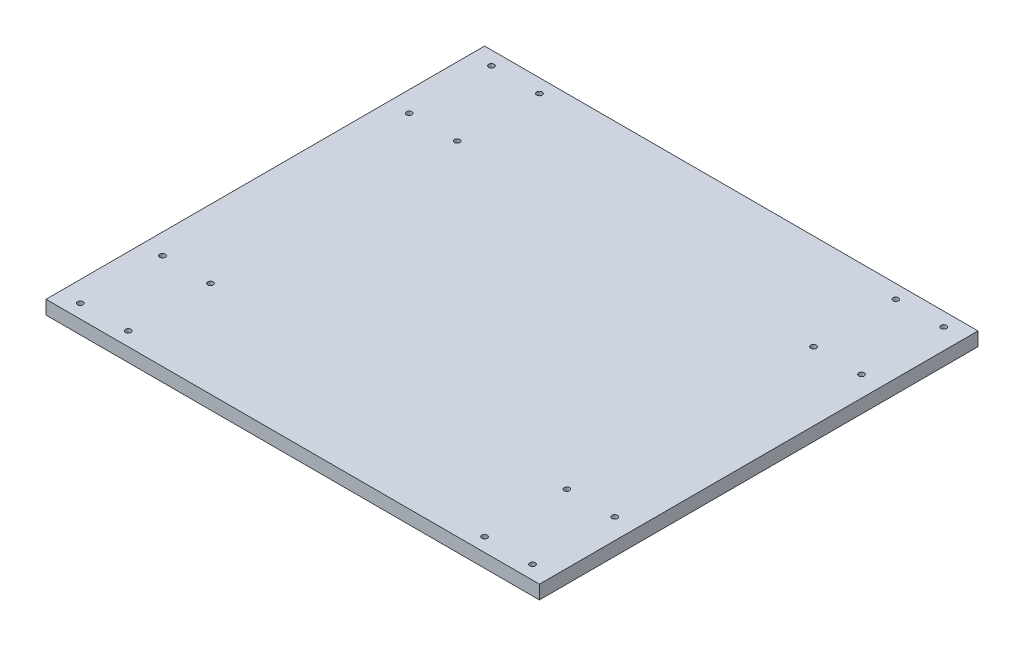
ISO-10303-21;
HEADER;
FILE_DESCRIPTION(('STEP AP214'),'2;1');
FILE_NAME('part.step','',(''),(''),'','','');
FILE_SCHEMA(('AUTOMOTIVE_DESIGN { 1 0 10303 214 1 1 1 1 }'));
ENDSEC;
DATA;
#1=APPLICATION_CONTEXT('core data for automotive mechanical design processes');
#2=APPLICATION_PROTOCOL_DEFINITION('international standard','automotive_design',2000,#1);
#3=PRODUCT_CONTEXT('',#1,'mechanical');
#4=PRODUCT('Part','Part','',(#3));
#5=PRODUCT_RELATED_PRODUCT_CATEGORY('part','',(#4));
#6=PRODUCT_DEFINITION_FORMATION('','',#4);
#7=PRODUCT_DEFINITION_CONTEXT('part definition',#1,'design');
#8=PRODUCT_DEFINITION('design','',#6,#7);
#9=PRODUCT_DEFINITION_SHAPE('','',#8);
#10=(LENGTH_UNIT() NAMED_UNIT(*) SI_UNIT(.MILLI.,.METRE.));
#11=(NAMED_UNIT(*) PLANE_ANGLE_UNIT() SI_UNIT($,.RADIAN.));
#12=(NAMED_UNIT(*) SI_UNIT($,.STERADIAN.) SOLID_ANGLE_UNIT());
#13=UNCERTAINTY_MEASURE_WITH_UNIT(LENGTH_MEASURE(1.E-05),#10,'distance_accuracy_value','');
#14=(GEOMETRIC_REPRESENTATION_CONTEXT(3) GLOBAL_UNCERTAINTY_ASSIGNED_CONTEXT((#13)) GLOBAL_UNIT_ASSIGNED_CONTEXT((#10,
#11,#12)) REPRESENTATION_CONTEXT('',''));
#15=CARTESIAN_POINT('',(0.,0.,0.));
#16=DIRECTION('',(0.,0.,1.));
#17=DIRECTION('',(1.,0.,0.));
#18=AXIS2_PLACEMENT_3D('',#15,#16,#17);
#19=CARTESIAN_POINT('',(0.,12.7,0.));
#20=DIRECTION('',(0.,-1.,0.));
#21=DIRECTION('',(0.,0.,-1.));
#22=AXIS2_PLACEMENT_3D('',#19,#20,#21);
#23=PLANE('',#22);
#24=CARTESIAN_POINT('',(-209.55,12.7,-114.3));
#25=DIRECTION('',(0.,1.,0.));
#26=DIRECTION('',(0.,0.,1.));
#27=AXIS2_PLACEMENT_3D('',#24,#25,#26);
#28=CIRCLE('',#27,2.55269999999999);
#29=CARTESIAN_POINT('',(-209.55,12.7,-111.7473));
#30=VERTEX_POINT('',#29);
#31=EDGE_CURVE('E190',#30,#30,#28,.T.);
#32=ORIENTED_EDGE('',*,*,#31,.F.);
#33=EDGE_LOOP('',(#32));
#34=FACE_BOUND('',#33,.T.);
#35=CARTESIAN_POINT('',(165.1,12.7,-114.3));
#36=DIRECTION('',(0.,1.,0.));
#37=DIRECTION('',(0.,0.,1.));
#38=AXIS2_PLACEMENT_3D('',#35,#36,#37);
#39=CIRCLE('',#38,2.55269999999999);
#40=CARTESIAN_POINT('',(165.1,12.7,-111.7473));
#41=VERTEX_POINT('',#40);
#42=EDGE_CURVE('E162',#41,#41,#39,.T.);
#43=ORIENTED_EDGE('',*,*,#42,.F.);
#44=EDGE_LOOP('',(#43));
#45=FACE_BOUND('',#44,.T.);
#46=CARTESIAN_POINT('',(165.1,12.7,-190.5));
#47=DIRECTION('',(0.,1.,0.));
#48=DIRECTION('',(0.,0.,1.));
#49=AXIS2_PLACEMENT_3D('',#46,#47,#48);
#50=CIRCLE('',#49,2.55269999999999);
#51=CARTESIAN_POINT('',(165.1,12.7,-187.9473));
#52=VERTEX_POINT('',#51);
#53=EDGE_CURVE('E157',#52,#52,#50,.T.);
#54=ORIENTED_EDGE('',*,*,#53,.F.);
#55=EDGE_LOOP('',(#54));
#56=FACE_BOUND('',#55,.T.);
#57=CARTESIAN_POINT('',(209.55,12.7,190.5));
#58=DIRECTION('',(0.,1.,0.));
#59=DIRECTION('',(0.,0.,1.));
#60=AXIS2_PLACEMENT_3D('',#57,#58,#59);
#61=CIRCLE('',#60,2.55269999999999);
#62=CARTESIAN_POINT('',(209.55,12.7,193.0527));
#63=VERTEX_POINT('',#62);
#64=EDGE_CURVE('E152',#63,#63,#61,.T.);
#65=ORIENTED_EDGE('',*,*,#64,.F.);
#66=EDGE_LOOP('',(#65));
#67=FACE_BOUND('',#66,.T.);
#68=CARTESIAN_POINT('',(209.55,12.7,114.3));
#69=DIRECTION('',(0.,1.,0.));
#70=DIRECTION('',(0.,0.,1.));
#71=AXIS2_PLACEMENT_3D('',#68,#69,#70);
#72=CIRCLE('',#71,2.55269999999999);
#73=CARTESIAN_POINT('',(209.55,12.7,116.8527));
#74=VERTEX_POINT('',#73);
#75=EDGE_CURVE('E151',#74,#74,#72,.T.);
#76=ORIENTED_EDGE('',*,*,#75,.F.);
#77=EDGE_LOOP('',(#76));
#78=FACE_BOUND('',#77,.T.);
#79=CARTESIAN_POINT('',(165.1,12.7,114.3));
#80=DIRECTION('',(0.,1.,0.));
#81=DIRECTION('',(0.,0.,1.));
#82=AXIS2_PLACEMENT_3D('',#79,#80,#81);
#83=CIRCLE('',#82,2.55269999999999);
#84=CARTESIAN_POINT('',(165.1,12.7,116.8527));
#85=VERTEX_POINT('',#84);
#86=EDGE_CURVE('E220',#85,#85,#83,.T.);
#87=ORIENTED_EDGE('',*,*,#86,.F.);
#88=EDGE_LOOP('',(#87));
#89=FACE_BOUND('',#88,.T.);
#90=CARTESIAN_POINT('',(165.1,12.7,190.5));
#91=DIRECTION('',(0.,1.,0.));
#92=DIRECTION('',(0.,0.,1.));
#93=AXIS2_PLACEMENT_3D('',#90,#91,#92);
#94=CIRCLE('',#93,2.55269999999999);
#95=CARTESIAN_POINT('',(165.1,12.7,193.0527));
#96=VERTEX_POINT('',#95);
#97=EDGE_CURVE('E146',#96,#96,#94,.T.);
#98=ORIENTED_EDGE('',*,*,#97,.F.);
#99=EDGE_LOOP('',(#98));
#100=FACE_BOUND('',#99,.T.);
#101=CARTESIAN_POINT('',(-209.55,12.7,190.5));
#102=DIRECTION('',(0.,1.,0.));
#103=DIRECTION('',(0.,0.,1.));
#104=AXIS2_PLACEMENT_3D('',#101,#102,#103);
#105=CIRCLE('',#104,2.55269999999999);
#106=CARTESIAN_POINT('',(-209.55,12.7,193.0527));
#107=VERTEX_POINT('',#106);
#108=EDGE_CURVE('E141',#107,#107,#105,.T.);
#109=ORIENTED_EDGE('',*,*,#108,.F.);
#110=EDGE_LOOP('',(#109));
#111=FACE_BOUND('',#110,.T.);
#112=CARTESIAN_POINT('',(-165.1,12.7,114.3));
#113=DIRECTION('',(0.,1.,0.));
#114=DIRECTION('',(0.,0.,1.));
#115=AXIS2_PLACEMENT_3D('',#112,#113,#114);
#116=CIRCLE('',#115,2.55269999999999);
#117=CARTESIAN_POINT('',(-165.1,12.7,116.8527));
#118=VERTEX_POINT('',#117);
#119=EDGE_CURVE('E135',#118,#118,#116,.T.);
#120=ORIENTED_EDGE('',*,*,#119,.F.);
#121=EDGE_LOOP('',(#120));
#122=FACE_BOUND('',#121,.T.);
#123=CARTESIAN_POINT('',(-165.1,12.7,190.5));
#124=DIRECTION('',(0.,1.,0.));
#125=DIRECTION('',(0.,0.,1.));
#126=AXIS2_PLACEMENT_3D('',#123,#124,#125);
#127=CIRCLE('',#126,2.55269999999999);
#128=CARTESIAN_POINT('',(-165.1,12.7,193.0527));
#129=VERTEX_POINT('',#128);
#130=EDGE_CURVE('E134',#129,#129,#127,.T.);
#131=ORIENTED_EDGE('',*,*,#130,.F.);
#132=EDGE_LOOP('',(#131));
#133=FACE_BOUND('',#132,.T.);
#134=DIRECTION('',(0.,0.,-1.));
#135=VECTOR('',#134,1.);
#136=CARTESIAN_POINT('',(-228.6,12.7,203.2));
#137=LINE('',#136,#135);
#138=CARTESIAN_POINT('',(-228.6,12.7,203.2));
#139=VERTEX_POINT('',#138);
#140=CARTESIAN_POINT('',(-228.6,12.7,-203.2));
#141=VERTEX_POINT('',#140);
#142=EDGE_CURVE('E106',#139,#141,#137,.T.);
#143=ORIENTED_EDGE('',*,*,#142,.F.);
#144=DIRECTION('',(1.,0.,0.));
#145=VECTOR('',#144,1.);
#146=CARTESIAN_POINT('',(-228.6,12.7,203.2));
#147=LINE('',#146,#145);
#148=CARTESIAN_POINT('',(228.6,12.7,203.2));
#149=VERTEX_POINT('',#148);
#150=EDGE_CURVE('E92',#139,#149,#147,.T.);
#151=ORIENTED_EDGE('',*,*,#150,.T.);
#152=DIRECTION('',(0.,0.,-1.));
#153=VECTOR('',#152,1.);
#154=CARTESIAN_POINT('',(228.6,12.7,203.2));
#155=LINE('',#154,#153);
#156=CARTESIAN_POINT('',(228.6,12.7,-203.2));
#157=VERTEX_POINT('',#156);
#158=EDGE_CURVE('E87',#149,#157,#155,.T.);
#159=ORIENTED_EDGE('',*,*,#158,.T.);
#160=DIRECTION('',(1.,0.,0.));
#161=VECTOR('',#160,1.);
#162=CARTESIAN_POINT('',(-228.6,12.7,-203.2));
#163=LINE('',#162,#161);
#164=EDGE_CURVE('E91',#141,#157,#163,.T.);
#165=ORIENTED_EDGE('',*,*,#164,.F.);
#166=EDGE_LOOP('',(#143,#151,#159,#165));
#167=FACE_BOUND('',#166,.T.);
#168=CARTESIAN_POINT('',(-209.55,12.7,114.3));
#169=DIRECTION('',(0.,1.,0.));
#170=DIRECTION('',(0.,0.,1.));
#171=AXIS2_PLACEMENT_3D('',#168,#169,#170);
#172=CIRCLE('',#171,2.55269999999999);
#173=CARTESIAN_POINT('',(-209.55,12.7,116.8527));
#174=VERTEX_POINT('',#173);
#175=EDGE_CURVE('E140',#174,#174,#172,.T.);
#176=ORIENTED_EDGE('',*,*,#175,.F.);
#177=EDGE_LOOP('',(#176));
#178=FACE_BOUND('',#177,.T.);
#179=CARTESIAN_POINT('',(209.55,12.7,-114.3));
#180=DIRECTION('',(0.,1.,0.));
#181=DIRECTION('',(0.,0.,1.));
#182=AXIS2_PLACEMENT_3D('',#179,#180,#181);
#183=CIRCLE('',#182,2.55269999999999);
#184=CARTESIAN_POINT('',(209.55,12.7,-111.7473));
#185=VERTEX_POINT('',#184);
#186=EDGE_CURVE('E167',#185,#185,#183,.T.);
#187=ORIENTED_EDGE('',*,*,#186,.F.);
#188=EDGE_LOOP('',(#187));
#189=FACE_BOUND('',#188,.T.);
#190=CARTESIAN_POINT('',(209.55,12.7,-190.5));
#191=DIRECTION('',(0.,1.,0.));
#192=DIRECTION('',(0.,0.,1.));
#193=AXIS2_PLACEMENT_3D('',#190,#191,#192);
#194=CIRCLE('',#193,2.55269999999999);
#195=CARTESIAN_POINT('',(209.55,12.7,-187.9473));
#196=VERTEX_POINT('',#195);
#197=EDGE_CURVE('E171',#196,#196,#194,.T.);
#198=ORIENTED_EDGE('',*,*,#197,.F.);
#199=EDGE_LOOP('',(#198));
#200=FACE_BOUND('',#199,.T.);
#201=CARTESIAN_POINT('',(-165.1,12.7,-190.5));
#202=DIRECTION('',(0.,1.,0.));
#203=DIRECTION('',(0.,0.,1.));
#204=AXIS2_PLACEMENT_3D('',#201,#202,#203);
#205=CIRCLE('',#204,2.55269999999999);
#206=CARTESIAN_POINT('',(-165.1,12.7,-187.9473));
#207=VERTEX_POINT('',#206);
#208=EDGE_CURVE('E172',#207,#207,#205,.T.);
#209=ORIENTED_EDGE('',*,*,#208,.F.);
#210=EDGE_LOOP('',(#209));
#211=FACE_BOUND('',#210,.T.);
#212=CARTESIAN_POINT('',(-165.1,12.7,-114.3));
#213=DIRECTION('',(0.,1.,0.));
#214=DIRECTION('',(0.,0.,1.));
#215=AXIS2_PLACEMENT_3D('',#212,#213,#214);
#216=CIRCLE('',#215,2.55269999999999);
#217=CARTESIAN_POINT('',(-165.1,12.7,-111.7473));
#218=VERTEX_POINT('',#217);
#219=EDGE_CURVE('E176',#218,#218,#216,.T.);
#220=ORIENTED_EDGE('',*,*,#219,.F.);
#221=EDGE_LOOP('',(#220));
#222=FACE_BOUND('',#221,.T.);
#223=CARTESIAN_POINT('',(-209.55,12.7,-190.5));
#224=DIRECTION('',(0.,1.,0.));
#225=DIRECTION('',(0.,0.,1.));
#226=AXIS2_PLACEMENT_3D('',#223,#224,#225);
#227=CIRCLE('',#226,2.55269999999999);
#228=CARTESIAN_POINT('',(-209.55,12.7,-187.9473));
#229=VERTEX_POINT('',#228);
#230=EDGE_CURVE('E468',#229,#229,#227,.T.);
#231=ORIENTED_EDGE('',*,*,#230,.F.);
#232=EDGE_LOOP('',(#231));
#233=FACE_BOUND('',#232,.T.);
#234=ADVANCED_FACE('F39',(#34,#45,#56,#67,#78,#89,#100,#111,#122,#133,#167,#178,#189,#200,#211,
#222,#233),#23,.F.);
#235=CARTESIAN_POINT('',(-228.6,12.7,203.2));
#236=DIRECTION('',(-1.,0.,0.));
#237=DIRECTION('',(0.,0.,1.));
#238=AXIS2_PLACEMENT_3D('',#235,#236,#237);
#239=PLANE('',#238);
#240=DIRECTION('',(0.,0.,-1.));
#241=VECTOR('',#240,1.);
#242=CARTESIAN_POINT('',(-228.6,0.,203.2));
#243=LINE('',#242,#241);
#244=CARTESIAN_POINT('',(-228.6,0.,203.2));
#245=VERTEX_POINT('',#244);
#246=CARTESIAN_POINT('',(-228.6,0.,-203.2));
#247=VERTEX_POINT('',#246);
#248=EDGE_CURVE('E114',#245,#247,#243,.T.);
#249=ORIENTED_EDGE('',*,*,#248,.F.);
#250=DIRECTION('',(0.,-1.,0.));
#251=VECTOR('',#250,1.);
#252=CARTESIAN_POINT('',(-228.6,12.7,203.2));
#253=LINE('',#252,#251);
#254=EDGE_CURVE('E11',#139,#245,#253,.T.);
#255=ORIENTED_EDGE('',*,*,#254,.F.);
#256=ORIENTED_EDGE('',*,*,#142,.T.);
#257=DIRECTION('',(0.,-1.,0.));
#258=VECTOR('',#257,1.);
#259=CARTESIAN_POINT('',(-228.6,12.7,-203.2));
#260=LINE('',#259,#258);
#261=EDGE_CURVE('E82',#141,#247,#260,.T.);
#262=ORIENTED_EDGE('',*,*,#261,.T.);
#263=EDGE_LOOP('',(#249,#255,#256,#262));
#264=FACE_BOUND('',#263,.T.);
#265=ADVANCED_FACE('F41',(#264),#239,.T.);
#266=CARTESIAN_POINT('',(-228.6,12.7,203.2));
#267=DIRECTION('',(0.,0.,-1.));
#268=DIRECTION('',(-1.,0.,0.));
#269=AXIS2_PLACEMENT_3D('',#266,#267,#268);
#270=PLANE('',#269);
#271=DIRECTION('',(1.,0.,0.));
#272=VECTOR('',#271,1.);
#273=CARTESIAN_POINT('',(-228.6,0.,203.2));
#274=LINE('',#273,#272);
#275=CARTESIAN_POINT('',(228.6,0.,203.2));
#276=VERTEX_POINT('',#275);
#277=EDGE_CURVE('E74',#245,#276,#274,.T.);
#278=ORIENTED_EDGE('',*,*,#277,.T.);
#279=DIRECTION('',(0.,-1.,0.));
#280=VECTOR('',#279,1.);
#281=CARTESIAN_POINT('',(228.6,12.7,203.2));
#282=LINE('',#281,#280);
#283=EDGE_CURVE('E50',#149,#276,#282,.T.);
#284=ORIENTED_EDGE('',*,*,#283,.F.);
#285=ORIENTED_EDGE('',*,*,#150,.F.);
#286=ORIENTED_EDGE('',*,*,#254,.T.);
#287=EDGE_LOOP('',(#278,#284,#285,#286));
#288=FACE_BOUND('',#287,.T.);
#289=ADVANCED_FACE('F259',(#288),#270,.F.);
#290=CARTESIAN_POINT('',(228.6,12.7,203.2));
#291=DIRECTION('',(-1.,0.,0.));
#292=DIRECTION('',(0.,0.,1.));
#293=AXIS2_PLACEMENT_3D('',#290,#291,#292);
#294=PLANE('',#293);
#295=DIRECTION('',(0.,0.,-1.));
#296=VECTOR('',#295,1.);
#297=CARTESIAN_POINT('',(228.6,0.,203.2));
#298=LINE('',#297,#296);
#299=CARTESIAN_POINT('',(228.6,0.,-203.2));
#300=VERTEX_POINT('',#299);
#301=EDGE_CURVE('E100',#276,#300,#298,.T.);
#302=ORIENTED_EDGE('',*,*,#301,.T.);
#303=DIRECTION('',(0.,-1.,0.));
#304=VECTOR('',#303,1.);
#305=CARTESIAN_POINT('',(228.6,12.7,-203.2));
#306=LINE('',#305,#304);
#307=EDGE_CURVE('E97',#157,#300,#306,.T.);
#308=ORIENTED_EDGE('',*,*,#307,.F.);
#309=ORIENTED_EDGE('',*,*,#158,.F.);
#310=ORIENTED_EDGE('',*,*,#283,.T.);
#311=EDGE_LOOP('',(#302,#308,#309,#310));
#312=FACE_BOUND('',#311,.T.);
#313=ADVANCED_FACE('F98',(#312),#294,.F.);
#314=CARTESIAN_POINT('',(-228.6,12.7,-203.2));
#315=DIRECTION('',(0.,0.,-1.));
#316=DIRECTION('',(-1.,0.,0.));
#317=AXIS2_PLACEMENT_3D('',#314,#315,#316);
#318=PLANE('',#317);
#319=DIRECTION('',(1.,0.,0.));
#320=VECTOR('',#319,1.);
#321=CARTESIAN_POINT('',(-228.6,0.,-203.2));
#322=LINE('',#321,#320);
#323=EDGE_CURVE('E118',#247,#300,#322,.T.);
#324=ORIENTED_EDGE('',*,*,#323,.F.);
#325=ORIENTED_EDGE('',*,*,#261,.F.);
#326=ORIENTED_EDGE('',*,*,#164,.T.);
#327=ORIENTED_EDGE('',*,*,#307,.T.);
#328=EDGE_LOOP('',(#324,#325,#326,#327));
#329=FACE_BOUND('',#328,.T.);
#330=ADVANCED_FACE('F104',(#329),#318,.T.);
#331=CARTESIAN_POINT('',(0.,0.,0.));
#332=DIRECTION('',(0.,-1.,0.));
#333=DIRECTION('',(0.,0.,-1.));
#334=AXIS2_PLACEMENT_3D('',#331,#332,#333);
#335=PLANE('',#334);
#336=CARTESIAN_POINT('',(-209.55,0.,-190.5));
#337=DIRECTION('',(0.,-1.,0.));
#338=DIRECTION('',(0.,0.,-1.));
#339=AXIS2_PLACEMENT_3D('',#336,#337,#338);
#340=CIRCLE('',#339,2.55269999999999);
#341=CARTESIAN_POINT('',(-209.55,0.,-193.0527));
#342=VERTEX_POINT('',#341);
#343=EDGE_CURVE('E43',#342,#342,#340,.T.);
#344=ORIENTED_EDGE('',*,*,#343,.F.);
#345=EDGE_LOOP('',(#344));
#346=FACE_BOUND('',#345,.T.);
#347=CARTESIAN_POINT('',(-209.55,0.,-114.3));
#348=DIRECTION('',(0.,-1.,0.));
#349=DIRECTION('',(0.,0.,-1.));
#350=AXIS2_PLACEMENT_3D('',#347,#348,#349);
#351=CIRCLE('',#350,2.55269999999999);
#352=CARTESIAN_POINT('',(-209.55,0.,-116.8527));
#353=VERTEX_POINT('',#352);
#354=EDGE_CURVE('E184',#353,#353,#351,.T.);
#355=ORIENTED_EDGE('',*,*,#354,.F.);
#356=EDGE_LOOP('',(#355));
#357=FACE_BOUND('',#356,.T.);
#358=CARTESIAN_POINT('',(-165.1,0.,-114.3));
#359=DIRECTION('',(0.,-1.,0.));
#360=DIRECTION('',(0.,0.,-1.));
#361=AXIS2_PLACEMENT_3D('',#358,#359,#360);
#362=CIRCLE('',#361,2.55269999999999);
#363=CARTESIAN_POINT('',(-165.1,0.,-116.8527));
#364=VERTEX_POINT('',#363);
#365=EDGE_CURVE('E173',#364,#364,#362,.T.);
#366=ORIENTED_EDGE('',*,*,#365,.F.);
#367=EDGE_LOOP('',(#366));
#368=FACE_BOUND('',#367,.T.);
#369=CARTESIAN_POINT('',(-165.1,0.,-190.5));
#370=DIRECTION('',(0.,-1.,0.));
#371=DIRECTION('',(0.,0.,-1.));
#372=AXIS2_PLACEMENT_3D('',#369,#370,#371);
#373=CIRCLE('',#372,2.55269999999999);
#374=CARTESIAN_POINT('',(-165.1,0.,-193.0527));
#375=VERTEX_POINT('',#374);
#376=EDGE_CURVE('E168',#375,#375,#373,.T.);
#377=ORIENTED_EDGE('',*,*,#376,.F.);
#378=EDGE_LOOP('',(#377));
#379=FACE_BOUND('',#378,.T.);
#380=CARTESIAN_POINT('',(209.55,0.,-190.5));
#381=DIRECTION('',(0.,-1.,0.));
#382=DIRECTION('',(0.,0.,-1.));
#383=AXIS2_PLACEMENT_3D('',#380,#381,#382);
#384=CIRCLE('',#383,2.55269999999999);
#385=CARTESIAN_POINT('',(209.55,0.,-193.0527));
#386=VERTEX_POINT('',#385);
#387=EDGE_CURVE('E197',#386,#386,#384,.T.);
#388=ORIENTED_EDGE('',*,*,#387,.F.);
#389=EDGE_LOOP('',(#388));
#390=FACE_BOUND('',#389,.T.);
#391=CARTESIAN_POINT('',(209.55,0.,-114.3));
#392=DIRECTION('',(0.,-1.,0.));
#393=DIRECTION('',(0.,0.,-1.));
#394=AXIS2_PLACEMENT_3D('',#391,#392,#393);
#395=CIRCLE('',#394,2.55269999999999);
#396=CARTESIAN_POINT('',(209.55,0.,-116.8527));
#397=VERTEX_POINT('',#396);
#398=EDGE_CURVE('E163',#397,#397,#395,.T.);
#399=ORIENTED_EDGE('',*,*,#398,.F.);
#400=EDGE_LOOP('',(#399));
#401=FACE_BOUND('',#400,.T.);
#402=CARTESIAN_POINT('',(165.1,0.,-114.3));
#403=DIRECTION('',(0.,-1.,0.));
#404=DIRECTION('',(0.,0.,-1.));
#405=AXIS2_PLACEMENT_3D('',#402,#403,#404);
#406=CIRCLE('',#405,2.55269999999999);
#407=CARTESIAN_POINT('',(165.1,0.,-116.8527));
#408=VERTEX_POINT('',#407);
#409=EDGE_CURVE('E158',#408,#408,#406,.T.);
#410=ORIENTED_EDGE('',*,*,#409,.F.);
#411=EDGE_LOOP('',(#410));
#412=FACE_BOUND('',#411,.T.);
#413=CARTESIAN_POINT('',(165.1,0.,-190.5));
#414=DIRECTION('',(0.,-1.,0.));
#415=DIRECTION('',(0.,0.,-1.));
#416=AXIS2_PLACEMENT_3D('',#413,#414,#415);
#417=CIRCLE('',#416,2.55269999999999);
#418=CARTESIAN_POINT('',(165.1,0.,-193.0527));
#419=VERTEX_POINT('',#418);
#420=EDGE_CURVE('E153',#419,#419,#417,.T.);
#421=ORIENTED_EDGE('',*,*,#420,.F.);
#422=EDGE_LOOP('',(#421));
#423=FACE_BOUND('',#422,.T.);
#424=CARTESIAN_POINT('',(209.55,0.,190.5));
#425=DIRECTION('',(0.,-1.,0.));
#426=DIRECTION('',(0.,0.,-1.));
#427=AXIS2_PLACEMENT_3D('',#424,#425,#426);
#428=CIRCLE('',#427,2.55269999999999);
#429=CARTESIAN_POINT('',(209.55,0.,187.9473));
#430=VERTEX_POINT('',#429);
#431=EDGE_CURVE('E147',#430,#430,#428,.T.);
#432=ORIENTED_EDGE('',*,*,#431,.F.);
#433=EDGE_LOOP('',(#432));
#434=FACE_BOUND('',#433,.T.);
#435=CARTESIAN_POINT('',(209.55,0.,114.3));
#436=DIRECTION('',(0.,-1.,0.));
#437=DIRECTION('',(0.,0.,-1.));
#438=AXIS2_PLACEMENT_3D('',#435,#436,#437);
#439=CIRCLE('',#438,2.55269999999999);
#440=CARTESIAN_POINT('',(209.55,0.,111.7473));
#441=VERTEX_POINT('',#440);
#442=EDGE_CURVE('E216',#441,#441,#439,.T.);
#443=ORIENTED_EDGE('',*,*,#442,.F.);
#444=EDGE_LOOP('',(#443));
#445=FACE_BOUND('',#444,.T.);
#446=CARTESIAN_POINT('',(165.1,0.,114.3));
#447=DIRECTION('',(0.,-1.,0.));
#448=DIRECTION('',(0.,0.,-1.));
#449=AXIS2_PLACEMENT_3D('',#446,#447,#448);
#450=CIRCLE('',#449,2.55269999999999);
#451=CARTESIAN_POINT('',(165.1,0.,111.7473));
#452=VERTEX_POINT('',#451);
#453=EDGE_CURVE('E224',#452,#452,#450,.T.);
#454=ORIENTED_EDGE('',*,*,#453,.F.);
#455=EDGE_LOOP('',(#454));
#456=FACE_BOUND('',#455,.T.);
#457=CARTESIAN_POINT('',(165.1,0.,190.5));
#458=DIRECTION('',(0.,-1.,0.));
#459=DIRECTION('',(0.,0.,-1.));
#460=AXIS2_PLACEMENT_3D('',#457,#458,#459);
#461=CIRCLE('',#460,2.55269999999999);
#462=CARTESIAN_POINT('',(165.1,0.,187.9473));
#463=VERTEX_POINT('',#462);
#464=EDGE_CURVE('E142',#463,#463,#461,.T.);
#465=ORIENTED_EDGE('',*,*,#464,.F.);
#466=EDGE_LOOP('',(#465));
#467=FACE_BOUND('',#466,.T.);
#468=CARTESIAN_POINT('',(-209.55,0.,190.5));
#469=DIRECTION('',(0.,-1.,0.));
#470=DIRECTION('',(0.,0.,-1.));
#471=AXIS2_PLACEMENT_3D('',#468,#469,#470);
#472=CIRCLE('',#471,2.55269999999999);
#473=CARTESIAN_POINT('',(-209.55,0.,187.9473));
#474=VERTEX_POINT('',#473);
#475=EDGE_CURVE('E136',#474,#474,#472,.T.);
#476=ORIENTED_EDGE('',*,*,#475,.F.);
#477=EDGE_LOOP('',(#476));
#478=FACE_BOUND('',#477,.T.);
#479=CARTESIAN_POINT('',(-209.55,0.,114.3));
#480=DIRECTION('',(0.,-1.,0.));
#481=DIRECTION('',(0.,0.,-1.));
#482=AXIS2_PLACEMENT_3D('',#479,#480,#481);
#483=CIRCLE('',#482,2.55269999999999);
#484=CARTESIAN_POINT('',(-209.55,0.,111.7473));
#485=VERTEX_POINT('',#484);
#486=EDGE_CURVE('E237',#485,#485,#483,.T.);
#487=ORIENTED_EDGE('',*,*,#486,.F.);
#488=EDGE_LOOP('',(#487));
#489=FACE_BOUND('',#488,.T.);
#490=CARTESIAN_POINT('',(-165.1,0.,114.3));
#491=DIRECTION('',(0.,-1.,0.));
#492=DIRECTION('',(0.,0.,-1.));
#493=AXIS2_PLACEMENT_3D('',#490,#491,#492);
#494=CIRCLE('',#493,2.55269999999999);
#495=CARTESIAN_POINT('',(-165.1,0.,111.7473));
#496=VERTEX_POINT('',#495);
#497=EDGE_CURVE('E130',#496,#496,#494,.T.);
#498=ORIENTED_EDGE('',*,*,#497,.F.);
#499=EDGE_LOOP('',(#498));
#500=FACE_BOUND('',#499,.T.);
#501=CARTESIAN_POINT('',(-165.1,0.,190.5));
#502=DIRECTION('',(0.,-1.,0.));
#503=DIRECTION('',(0.,0.,-1.));
#504=AXIS2_PLACEMENT_3D('',#501,#502,#503);
#505=CIRCLE('',#504,2.55269999999999);
#506=CARTESIAN_POINT('',(-165.1,0.,187.9473));
#507=VERTEX_POINT('',#506);
#508=EDGE_CURVE('E119',#507,#507,#505,.T.);
#509=ORIENTED_EDGE('',*,*,#508,.F.);
#510=EDGE_LOOP('',(#509));
#511=FACE_BOUND('',#510,.T.);
#512=ORIENTED_EDGE('',*,*,#248,.T.);
#513=ORIENTED_EDGE('',*,*,#323,.T.);
#514=ORIENTED_EDGE('',*,*,#301,.F.);
#515=ORIENTED_EDGE('',*,*,#277,.F.);
#516=EDGE_LOOP('',(#512,#513,#514,#515));
#517=FACE_BOUND('',#516,.T.);
#518=ADVANCED_FACE('F253',(#346,#357,#368,#379,#390,#401,#412,#423,#434,#445,#456,#467,#478,
#489,#500,#511,#517),#335,.T.);
#519=CARTESIAN_POINT('',(-165.1,12.7,190.5));
#520=DIRECTION('',(0.,1.,0.));
#521=DIRECTION('',(0.,0.,1.));
#522=AXIS2_PLACEMENT_3D('',#519,#520,#521);
#523=CYLINDRICAL_SURFACE('',#522,2.55269999999999);
#524=ORIENTED_EDGE('',*,*,#508,.T.);
#525=EDGE_LOOP('',(#524));
#526=FACE_BOUND('',#525,.T.);
#527=ORIENTED_EDGE('',*,*,#130,.T.);
#528=EDGE_LOOP('',(#527));
#529=FACE_BOUND('',#528,.T.);
#530=ADVANCED_FACE('F250',(#526,#529),#523,.F.);
#531=CARTESIAN_POINT('',(-165.1,12.7,114.3));
#532=DIRECTION('',(0.,1.,0.));
#533=DIRECTION('',(0.,0.,1.));
#534=AXIS2_PLACEMENT_3D('',#531,#532,#533);
#535=CYLINDRICAL_SURFACE('',#534,2.55269999999999);
#536=ORIENTED_EDGE('',*,*,#497,.T.);
#537=EDGE_LOOP('',(#536));
#538=FACE_BOUND('',#537,.T.);
#539=ORIENTED_EDGE('',*,*,#119,.T.);
#540=EDGE_LOOP('',(#539));
#541=FACE_BOUND('',#540,.T.);
#542=ADVANCED_FACE('F291',(#538,#541),#535,.F.);
#543=CARTESIAN_POINT('',(-209.55,12.7,114.3));
#544=DIRECTION('',(0.,1.,0.));
#545=DIRECTION('',(0.,0.,1.));
#546=AXIS2_PLACEMENT_3D('',#543,#544,#545);
#547=CYLINDRICAL_SURFACE('',#546,2.55269999999999);
#548=ORIENTED_EDGE('',*,*,#486,.T.);
#549=EDGE_LOOP('',(#548));
#550=FACE_BOUND('',#549,.T.);
#551=ORIENTED_EDGE('',*,*,#175,.T.);
#552=EDGE_LOOP('',(#551));
#553=FACE_BOUND('',#552,.T.);
#554=ADVANCED_FACE('F297',(#550,#553),#547,.F.);
#555=CARTESIAN_POINT('',(-209.55,12.7,190.5));
#556=DIRECTION('',(0.,1.,0.));
#557=DIRECTION('',(0.,0.,1.));
#558=AXIS2_PLACEMENT_3D('',#555,#556,#557);
#559=CYLINDRICAL_SURFACE('',#558,2.55269999999999);
#560=ORIENTED_EDGE('',*,*,#475,.T.);
#561=EDGE_LOOP('',(#560));
#562=FACE_BOUND('',#561,.T.);
#563=ORIENTED_EDGE('',*,*,#108,.T.);
#564=EDGE_LOOP('',(#563));
#565=FACE_BOUND('',#564,.T.);
#566=ADVANCED_FACE('F304',(#562,#565),#559,.F.);
#567=CARTESIAN_POINT('',(165.1,12.7,190.5));
#568=DIRECTION('',(0.,1.,0.));
#569=DIRECTION('',(0.,0.,1.));
#570=AXIS2_PLACEMENT_3D('',#567,#568,#569);
#571=CYLINDRICAL_SURFACE('',#570,2.55269999999999);
#572=ORIENTED_EDGE('',*,*,#464,.T.);
#573=EDGE_LOOP('',(#572));
#574=FACE_BOUND('',#573,.T.);
#575=ORIENTED_EDGE('',*,*,#97,.T.);
#576=EDGE_LOOP('',(#575));
#577=FACE_BOUND('',#576,.T.);
#578=ADVANCED_FACE('F312',(#574,#577),#571,.F.);
#579=CARTESIAN_POINT('',(165.1,12.7,114.3));
#580=DIRECTION('',(0.,1.,0.));
#581=DIRECTION('',(0.,0.,1.));
#582=AXIS2_PLACEMENT_3D('',#579,#580,#581);
#583=CYLINDRICAL_SURFACE('',#582,2.55269999999999);
#584=ORIENTED_EDGE('',*,*,#453,.T.);
#585=EDGE_LOOP('',(#584));
#586=FACE_BOUND('',#585,.T.);
#587=ORIENTED_EDGE('',*,*,#86,.T.);
#588=EDGE_LOOP('',(#587));
#589=FACE_BOUND('',#588,.T.);
#590=ADVANCED_FACE('F320',(#586,#589),#583,.F.);
#591=CARTESIAN_POINT('',(209.55,12.7,114.3));
#592=DIRECTION('',(0.,1.,0.));
#593=DIRECTION('',(0.,0.,1.));
#594=AXIS2_PLACEMENT_3D('',#591,#592,#593);
#595=CYLINDRICAL_SURFACE('',#594,2.55269999999999);
#596=ORIENTED_EDGE('',*,*,#442,.T.);
#597=EDGE_LOOP('',(#596));
#598=FACE_BOUND('',#597,.T.);
#599=ORIENTED_EDGE('',*,*,#75,.T.);
#600=EDGE_LOOP('',(#599));
#601=FACE_BOUND('',#600,.T.);
#602=ADVANCED_FACE('F328',(#598,#601),#595,.F.);
#603=CARTESIAN_POINT('',(209.55,12.7,190.5));
#604=DIRECTION('',(0.,1.,0.));
#605=DIRECTION('',(0.,0.,1.));
#606=AXIS2_PLACEMENT_3D('',#603,#604,#605);
#607=CYLINDRICAL_SURFACE('',#606,2.55269999999999);
#608=ORIENTED_EDGE('',*,*,#431,.T.);
#609=EDGE_LOOP('',(#608));
#610=FACE_BOUND('',#609,.T.);
#611=ORIENTED_EDGE('',*,*,#64,.T.);
#612=EDGE_LOOP('',(#611));
#613=FACE_BOUND('',#612,.T.);
#614=ADVANCED_FACE('F336',(#610,#613),#607,.F.);
#615=CARTESIAN_POINT('',(165.1,12.7,-190.5));
#616=DIRECTION('',(0.,1.,0.));
#617=DIRECTION('',(0.,0.,1.));
#618=AXIS2_PLACEMENT_3D('',#615,#616,#617);
#619=CYLINDRICAL_SURFACE('',#618,2.55269999999999);
#620=ORIENTED_EDGE('',*,*,#420,.T.);
#621=EDGE_LOOP('',(#620));
#622=FACE_BOUND('',#621,.T.);
#623=ORIENTED_EDGE('',*,*,#53,.T.);
#624=EDGE_LOOP('',(#623));
#625=FACE_BOUND('',#624,.T.);
#626=ADVANCED_FACE('F344',(#622,#625),#619,.F.);
#627=CARTESIAN_POINT('',(165.1,12.7,-114.3));
#628=DIRECTION('',(0.,1.,0.));
#629=DIRECTION('',(0.,0.,1.));
#630=AXIS2_PLACEMENT_3D('',#627,#628,#629);
#631=CYLINDRICAL_SURFACE('',#630,2.55269999999999);
#632=ORIENTED_EDGE('',*,*,#409,.T.);
#633=EDGE_LOOP('',(#632));
#634=FACE_BOUND('',#633,.T.);
#635=ORIENTED_EDGE('',*,*,#42,.T.);
#636=EDGE_LOOP('',(#635));
#637=FACE_BOUND('',#636,.T.);
#638=ADVANCED_FACE('F351',(#634,#637),#631,.F.);
#639=CARTESIAN_POINT('',(209.55,12.7,-114.3));
#640=DIRECTION('',(0.,1.,0.));
#641=DIRECTION('',(0.,0.,1.));
#642=AXIS2_PLACEMENT_3D('',#639,#640,#641);
#643=CYLINDRICAL_SURFACE('',#642,2.55269999999999);
#644=ORIENTED_EDGE('',*,*,#398,.T.);
#645=EDGE_LOOP('',(#644));
#646=FACE_BOUND('',#645,.T.);
#647=ORIENTED_EDGE('',*,*,#186,.T.);
#648=EDGE_LOOP('',(#647));
#649=FACE_BOUND('',#648,.T.);
#650=ADVANCED_FACE('F359',(#646,#649),#643,.F.);
#651=CARTESIAN_POINT('',(209.55,12.7,-190.5));
#652=DIRECTION('',(0.,1.,0.));
#653=DIRECTION('',(0.,0.,1.));
#654=AXIS2_PLACEMENT_3D('',#651,#652,#653);
#655=CYLINDRICAL_SURFACE('',#654,2.55269999999999);
#656=ORIENTED_EDGE('',*,*,#387,.T.);
#657=EDGE_LOOP('',(#656));
#658=FACE_BOUND('',#657,.T.);
#659=ORIENTED_EDGE('',*,*,#197,.T.);
#660=EDGE_LOOP('',(#659));
#661=FACE_BOUND('',#660,.T.);
#662=ADVANCED_FACE('F367',(#658,#661),#655,.F.);
#663=CARTESIAN_POINT('',(-165.1,12.7,-190.5));
#664=DIRECTION('',(0.,1.,0.));
#665=DIRECTION('',(0.,0.,1.));
#666=AXIS2_PLACEMENT_3D('',#663,#664,#665);
#667=CYLINDRICAL_SURFACE('',#666,2.55269999999999);
#668=ORIENTED_EDGE('',*,*,#376,.T.);
#669=EDGE_LOOP('',(#668));
#670=FACE_BOUND('',#669,.T.);
#671=ORIENTED_EDGE('',*,*,#208,.T.);
#672=EDGE_LOOP('',(#671));
#673=FACE_BOUND('',#672,.T.);
#674=ADVANCED_FACE('F375',(#670,#673),#667,.F.);
#675=CARTESIAN_POINT('',(-165.1,12.7,-114.3));
#676=DIRECTION('',(0.,1.,0.));
#677=DIRECTION('',(0.,0.,1.));
#678=AXIS2_PLACEMENT_3D('',#675,#676,#677);
#679=CYLINDRICAL_SURFACE('',#678,2.55269999999999);
#680=ORIENTED_EDGE('',*,*,#365,.T.);
#681=EDGE_LOOP('',(#680));
#682=FACE_BOUND('',#681,.T.);
#683=ORIENTED_EDGE('',*,*,#219,.T.);
#684=EDGE_LOOP('',(#683));
#685=FACE_BOUND('',#684,.T.);
#686=ADVANCED_FACE('F383',(#682,#685),#679,.F.);
#687=CARTESIAN_POINT('',(-209.55,12.7,-114.3));
#688=DIRECTION('',(0.,1.,0.));
#689=DIRECTION('',(0.,0.,1.));
#690=AXIS2_PLACEMENT_3D('',#687,#688,#689);
#691=CYLINDRICAL_SURFACE('',#690,2.55269999999999);
#692=ORIENTED_EDGE('',*,*,#354,.T.);
#693=EDGE_LOOP('',(#692));
#694=FACE_BOUND('',#693,.T.);
#695=ORIENTED_EDGE('',*,*,#31,.T.);
#696=EDGE_LOOP('',(#695));
#697=FACE_BOUND('',#696,.T.);
#698=ADVANCED_FACE('F391',(#694,#697),#691,.F.);
#699=CARTESIAN_POINT('',(-209.55,12.7,-190.5));
#700=DIRECTION('',(0.,1.,0.));
#701=DIRECTION('',(0.,0.,1.));
#702=AXIS2_PLACEMENT_3D('',#699,#700,#701);
#703=CYLINDRICAL_SURFACE('',#702,2.55269999999999);
#704=ORIENTED_EDGE('',*,*,#343,.T.);
#705=EDGE_LOOP('',(#704));
#706=FACE_BOUND('',#705,.T.);
#707=ORIENTED_EDGE('',*,*,#230,.T.);
#708=EDGE_LOOP('',(#707));
#709=FACE_BOUND('',#708,.T.);
#710=ADVANCED_FACE('F398',(#706,#709),#703,.F.);
#711=CLOSED_SHELL('',(#234,#265,#289,#313,#330,#518,#530,#542,#554,#566,#578,#590,#602,#614,
#626,#638,#650,#662,#674,#686,#698,#710));
#712=MANIFOLD_SOLID_BREP('B2',#711);
#713=ADVANCED_BREP_SHAPE_REPRESENTATION('',(#18,#712),#14);
#714=SHAPE_DEFINITION_REPRESENTATION(#9,#713);
ENDSEC;
END-ISO-10303-21;
